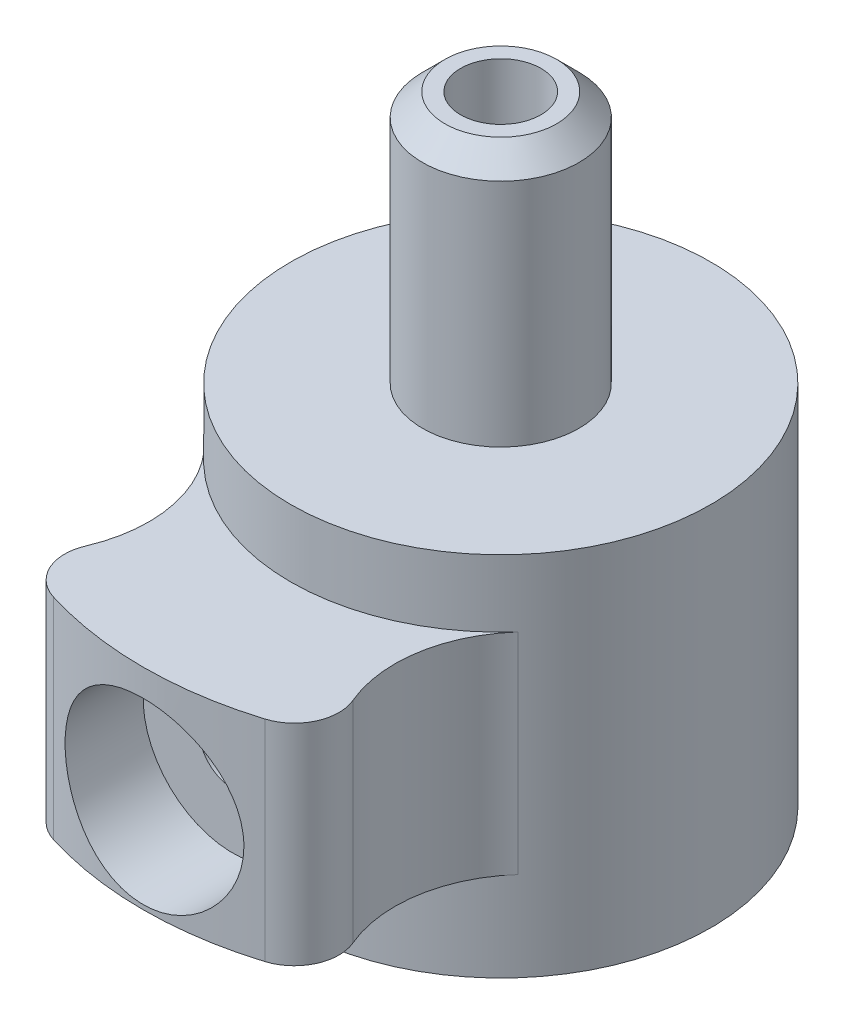
ISO-10303-21;
HEADER;
FILE_DESCRIPTION(('STEP AP214'),'2;1');
FILE_NAME('part.step','',(''),(''),'','','');
FILE_SCHEMA(('AUTOMOTIVE_DESIGN { 1 0 10303 214 1 1 1 1 }'));
ENDSEC;
DATA;
#1=APPLICATION_CONTEXT('core data for automotive mechanical design processes');
#2=APPLICATION_PROTOCOL_DEFINITION('international standard','automotive_design',2000,#1);
#3=PRODUCT_CONTEXT('',#1,'mechanical');
#4=PRODUCT('Part','Part','',(#3));
#5=PRODUCT_RELATED_PRODUCT_CATEGORY('part','',(#4));
#6=PRODUCT_DEFINITION_FORMATION('','',#4);
#7=PRODUCT_DEFINITION_CONTEXT('part definition',#1,'design');
#8=PRODUCT_DEFINITION('design','',#6,#7);
#9=PRODUCT_DEFINITION_SHAPE('','',#8);
#10=(LENGTH_UNIT() NAMED_UNIT(*) SI_UNIT(.MILLI.,.METRE.));
#11=(NAMED_UNIT(*) PLANE_ANGLE_UNIT() SI_UNIT($,.RADIAN.));
#12=(NAMED_UNIT(*) SI_UNIT($,.STERADIAN.) SOLID_ANGLE_UNIT());
#13=UNCERTAINTY_MEASURE_WITH_UNIT(LENGTH_MEASURE(1.E-05),#10,'distance_accuracy_value','');
#14=(GEOMETRIC_REPRESENTATION_CONTEXT(3) GLOBAL_UNCERTAINTY_ASSIGNED_CONTEXT((#13)) GLOBAL_UNIT_ASSIGNED_CONTEXT((#10,
#11,#12)) REPRESENTATION_CONTEXT('',''));
#15=CARTESIAN_POINT('',(0.,0.,0.));
#16=DIRECTION('',(0.,0.,1.));
#17=DIRECTION('',(1.,0.,0.));
#18=AXIS2_PLACEMENT_3D('',#15,#16,#17);
#19=CARTESIAN_POINT('',(0.,0.,0.));
#20=DIRECTION('',(0.,-1.,0.));
#21=DIRECTION('',(0.,0.,-1.));
#22=AXIS2_PLACEMENT_3D('',#19,#20,#21);
#23=CYLINDRICAL_SURFACE('',#22,8.);
#24=CARTESIAN_POINT('',(2.,4.1,7.74596669241483));
#25=CARTESIAN_POINT('',(1.99999686287446,3.98955939925874,7.74596880070288));
#26=CARTESIAN_POINT('',(1.99082099639812,3.87908408105718,7.74835444811678));
#27=CARTESIAN_POINT('',(1.95441850037103,3.66130593746119,7.75761489594051));
#28=CARTESIAN_POINT('',(1.92718136539368,3.55400499642545,7.76449230897304));
#29=CARTESIAN_POINT('',(1.85559295970563,3.34575716945025,7.7819097967692));
#30=CARTESIAN_POINT('',(1.81126378228359,3.24480227569143,7.79244514152366));
#31=CARTESIAN_POINT('',(1.70681691300911,3.05175131796809,7.81598553623007));
#32=CARTESIAN_POINT('',(1.64669855084855,2.95965563033582,7.82899069102791));
#33=CARTESIAN_POINT('',(1.51096674184951,2.78491068379023,7.856325730845));
#34=CARTESIAN_POINT('',(1.43506951016324,2.70248511971996,7.87067678098427));
#35=CARTESIAN_POINT('',(1.27054565128053,2.55139088451173,7.89890300412235));
#36=CARTESIAN_POINT('',(1.18191783534424,2.4827234995026,7.91277813253111));
#37=CARTESIAN_POINT('',(0.992916160863163,2.36017962589497,7.93872332416466));
#38=CARTESIAN_POINT('',(0.892395660956096,2.30652288947082,7.95076549920474));
#39=CARTESIAN_POINT('',(0.68341054743421,2.21695228467753,7.97144649540787));
#40=CARTESIAN_POINT('',(0.574947108633552,2.18103579846759,7.98008581867475));
#41=CARTESIAN_POINT('',(0.355487007003329,2.12868173233713,7.99283807078544));
#42=CARTESIAN_POINT('',(0.24458617563918,2.11186428453873,7.99703915075451));
#43=CARTESIAN_POINT('',(0.021463055410215,2.09699329657956,8.00074875285838));
#44=CARTESIAN_POINT('',(-0.0907590356304554,2.09893698223232,8.00025796877363));
#45=CARTESIAN_POINT('',(-0.310704494344775,2.12125988020011,7.99470475962828));
#46=CARTESIAN_POINT('',(-0.418472431202135,2.14122906004308,7.98974401872699));
#47=CARTESIAN_POINT('',(-0.629076494827373,2.1983770160388,7.97592669219883));
#48=CARTESIAN_POINT('',(-0.731912358740877,2.23555670830192,7.96706989918753));
#49=CARTESIAN_POINT('',(-0.930813407003614,2.32640205654965,7.94630007760717));
#50=CARTESIAN_POINT('',(-1.02680901953301,2.38021363572939,7.93436015756043));
#51=CARTESIAN_POINT('',(-1.20855124468098,2.502684543293,7.90871923047719));
#52=CARTESIAN_POINT('',(-1.29429607017101,2.57134645484849,7.89501791721992));
#53=CARTESIAN_POINT('',(-1.45554807016991,2.7237669935859,7.86690971015616));
#54=CARTESIAN_POINT('',(-1.5307153581504,2.80788391387822,7.85249375620734));
#55=CARTESIAN_POINT('',(-1.66595275192604,2.9876799788322,7.82492034813365));
#56=CARTESIAN_POINT('',(-1.72602215209203,3.0833596635928,7.81176295284776));
#57=CARTESIAN_POINT('',(-1.8295762580452,3.28423202731917,7.78816397465319));
#58=CARTESIAN_POINT('',(-1.87297913394098,3.38946858425055,7.77773586980577));
#59=CARTESIAN_POINT('',(-1.94137124127268,3.60606837446116,7.76094912111966));
#60=CARTESIAN_POINT('',(-1.96636441310582,3.71743029118651,7.75458960648175));
#61=CARTESIAN_POINT('',(-1.99666371093214,3.9399676012185,7.74684284831313));
#62=CARTESIAN_POINT('',(-2.0024723791357,4.0510702346637,7.74532871274919));
#63=CARTESIAN_POINT('',(-1.99561359241244,4.27265754926252,7.74709874784831));
#64=CARTESIAN_POINT('',(-1.98294783827904,4.38314228636099,7.75038247681013));
#65=CARTESIAN_POINT('',(-1.93994037115013,4.59849141196376,7.76125665563648));
#66=CARTESIAN_POINT('',(-1.9098912546254,4.70341818125667,7.768775761875));
#67=CARTESIAN_POINT('',(-1.8332944653365,4.90674516628135,7.7872057461677));
#68=CARTESIAN_POINT('',(-1.78674483817004,5.00514460724427,7.79811702598891));
#69=CARTESIAN_POINT('',(-1.67741653434925,5.19475302229388,7.8223690967461));
#70=CARTESIAN_POINT('',(-1.6143374030685,5.28578307203448,7.83575334885313));
#71=CARTESIAN_POINT('',(-1.47412058586891,5.45615069024108,7.86333666457373));
#72=CARTESIAN_POINT('',(-1.39698058961088,5.53548633332006,7.87753586182776));
#73=CARTESIAN_POINT('',(-1.22852544196945,5.68224883405676,7.90557922425285));
#74=CARTESIAN_POINT('',(-1.13690390506318,5.74932805003905,7.91940561649468));
#75=CARTESIAN_POINT('',(-0.94340536538935,5.86714869356099,7.94477773290987));
#76=CARTESIAN_POINT('',(-0.841528897915181,5.91789097328656,7.95632357603169));
#77=CARTESIAN_POINT('',(-0.631116403462181,6.00115682762234,7.9757609259065));
#78=CARTESIAN_POINT('',(-0.522634762055764,6.03381142750325,7.98367864017925));
#79=CARTESIAN_POINT('',(-0.301499520637614,6.08036826768673,7.99508234716634));
#80=CARTESIAN_POINT('',(-0.188846730082481,6.09427412699123,7.99856919514738));
#81=CARTESIAN_POINT('',(0.0341670528866469,6.10273517915108,8.00068338817612));
#82=CARTESIAN_POINT('',(0.144507653932044,6.09780341819081,7.99943957759977));
#83=CARTESIAN_POINT('',(0.362734992829503,6.0699043454113,7.99251792914887));
#84=CARTESIAN_POINT('',(0.470621803561858,6.04693756997366,7.98684022314338));
#85=CARTESIAN_POINT('',(0.680342071289548,5.98389556045828,7.97170865707778));
#86=CARTESIAN_POINT('',(0.782204989161726,5.94391309337124,7.96227529004785));
#87=CARTESIAN_POINT('',(0.977834106083248,5.84805884196085,7.94062577827316));
#88=CARTESIAN_POINT('',(1.07159928253127,5.79218505465903,7.92840928277515));
#89=CARTESIAN_POINT('',(1.25080385684661,5.66456953200773,7.90214499360574));
#90=CARTESIAN_POINT('',(1.33598997659667,5.59247971419234,7.88806033883329));
#91=CARTESIAN_POINT('',(1.49323004054701,5.4351542960453,7.85981298114379));
#92=CARTESIAN_POINT('',(1.56528065015318,5.34991536777767,7.84565025934604));
#93=CARTESIAN_POINT('',(1.69552405294366,5.16679717162108,7.81854951691005));
#94=CARTESIAN_POINT('',(1.75343323883276,5.06871175326949,7.80563927346578));
#95=CARTESIAN_POINT('',(1.85185379317094,4.86388902025036,7.78287910989656));
#96=CARTESIAN_POINT('',(1.8923778195043,4.7571580678123,7.77302696466428));
#97=CARTESIAN_POINT('',(1.94884505714201,4.55884597632968,7.75903817501475));
#98=CARTESIAN_POINT('',(1.96798634119376,4.46821367122772,7.75417326006998));
#99=CARTESIAN_POINT('',(1.99356458514354,4.28506226200462,7.7476367716524));
#100=CARTESIAN_POINT('',(2.0000026287435,4.19254331951119,7.74596492578215));
#101=CARTESIAN_POINT('',(2.,4.1,7.74596669241483));
#102=B_SPLINE_CURVE_WITH_KNOTS('',3,(#24,#25,#26,#27,#28,#29,#30,#31,#32,#33,#34,#35,#36,#37,
#38,#39,#40,#41,#42,#43,#44,#45,#46,#47,#48,#49,#50,#51,#52,#53,#54,#55,#56,#57,#58,#59,#60,#61,
#62,#63,#64,#65,#66,#67,#68,#69,#70,#71,#72,#73,#74,#75,#76,#77,#78,#79,#80,#81,#82,#83,#84,#85,
#86,#87,#88,#89,#90,#91,#92,#93,#94,#95,#96,#97,#98,#99,#100,#101),.UNSPECIFIED.,.T.,.F.,(4,2,2,
2,2,2,2,2,2,2,2,2,2,2,2,2,2,2,2,2,2,2,2,2,2,2,2,2,2,2,2,2,2,2,2,2,2,2,4),(0.,0.330981953388909,
0.662156593142933,0.992904581732817,1.32366661404383,1.66099163354381,1.99834817183893,
2.34041197118336,2.68242527877674,3.01751000796277,3.35254518932816,3.68014610151158,
4.00776445379829,4.33834299403556,4.66897908375131,5.00856373257529,5.34816424959842,
5.68941145606722,6.03058560103638,6.36274859809374,6.69488101747042,7.02157924007366,
7.34831617137134,7.68146276687326,8.01466415108036,8.35620264772255,8.69772332575643,
9.03673658245543,9.37568439127231,9.70546756901965,10.0352409390158,10.3632390124777,
10.6912784459046,11.0271767726566,11.3631602525241,11.7054118182895,12.0474137709606,
12.3247826174462,12.6021278008238),.UNSPECIFIED.);
#103=CARTESIAN_POINT('',(2.,4.1,7.74596669241483));
#104=VERTEX_POINT('',#103);
#105=EDGE_CURVE('E147',#104,#104,#102,.T.);
#106=ORIENTED_EDGE('',*,*,#105,.T.);
#107=EDGE_LOOP('',(#106));
#108=FACE_BOUND('',#107,.T.);
#109=CARTESIAN_POINT('',(0.,2.,0.));
#110=DIRECTION('',(0.,-1.,0.));
#111=DIRECTION('',(0.,0.,-1.));
#112=AXIS2_PLACEMENT_3D('',#109,#110,#111);
#113=CIRCLE('',#112,8.);
#114=CARTESIAN_POINT('',(2.36484696607376,2.,7.64247988725203));
#115=VERTEX_POINT('',#114);
#116=CARTESIAN_POINT('',(-2.36484696607376,2.,7.64247988725203));
#117=VERTEX_POINT('',#116);
#118=EDGE_CURVE('E214',#115,#117,#113,.T.);
#119=ORIENTED_EDGE('',*,*,#118,.F.);
#120=DIRECTION('',(0.,-1.,0.));
#121=VECTOR('',#120,1.);
#122=CARTESIAN_POINT('',(2.36484696607376,0.,7.64247988725203));
#123=LINE('',#122,#121);
#124=CARTESIAN_POINT('',(2.36484696607376,6.7,7.64247988725203));
#125=VERTEX_POINT('',#124);
#126=EDGE_CURVE('E143',#115,#125,#123,.F.);
#127=ORIENTED_EDGE('',*,*,#126,.T.);
#128=CARTESIAN_POINT('',(0.,6.7,0.));
#129=DIRECTION('',(0.,1.,0.));
#130=DIRECTION('',(0.,0.,1.));
#131=AXIS2_PLACEMENT_3D('',#128,#129,#130);
#132=CIRCLE('',#131,8.);
#133=CARTESIAN_POINT('',(-2.36484696607376,6.7,7.64247988725203));
#134=VERTEX_POINT('',#133);
#135=EDGE_CURVE('E223',#134,#125,#132,.T.);
#136=ORIENTED_EDGE('',*,*,#135,.F.);
#137=DIRECTION('',(0.,-1.,0.));
#138=VECTOR('',#137,1.);
#139=CARTESIAN_POINT('',(-2.36484696607376,0.,7.64247988725203));
#140=LINE('',#139,#138);
#141=EDGE_CURVE('E140',#134,#117,#140,.T.);
#142=ORIENTED_EDGE('',*,*,#141,.T.);
#143=EDGE_LOOP('',(#119,#127,#136,#142));
#144=FACE_BOUND('',#143,.T.);
#145=ADVANCED_FACE('F36',(#108,#144),#23,.T.);
#146=CARTESIAN_POINT('',(5.75,0.,5.12127913709065));
#147=DIRECTION('',(0.,1.,0.));
#148=DIRECTION('',(0.,0.,1.));
#149=AXIS2_PLACEMENT_3D('',#146,#147,#148);
#150=CYLINDRICAL_SURFACE('',#149,3.);
#151=CARTESIAN_POINT('',(5.75,2.,5.12127913709065));
#152=DIRECTION('',(0.,-1.,0.));
#153=DIRECTION('',(0.,0.,-1.));
#154=AXIS2_PLACEMENT_3D('',#151,#152,#153);
#155=CIRCLE('',#154,3.);
#156=CARTESIAN_POINT('',(3.50974025974026,2.,3.1259755771852));
#157=VERTEX_POINT('',#156);
#158=CARTESIAN_POINT('',(2.9894308214859,2.,6.29569721028181));
#159=VERTEX_POINT('',#158);
#160=EDGE_CURVE('E96',#157,#159,#155,.F.);
#161=ORIENTED_EDGE('',*,*,#160,.F.);
#162=DIRECTION('',(0.,1.,0.));
#163=VECTOR('',#162,1.);
#164=CARTESIAN_POINT('',(3.50974025974026,0.,3.12597557718521));
#165=LINE('',#164,#163);
#166=CARTESIAN_POINT('',(3.50974025974026,6.7,3.1259755771852));
#167=VERTEX_POINT('',#166);
#168=EDGE_CURVE('E107',#157,#167,#165,.T.);
#169=ORIENTED_EDGE('',*,*,#168,.T.);
#170=CARTESIAN_POINT('',(5.75,6.7,5.12127913709065));
#171=DIRECTION('',(0.,1.,0.));
#172=DIRECTION('',(0.,0.,1.));
#173=AXIS2_PLACEMENT_3D('',#170,#171,#172);
#174=CIRCLE('',#173,3.);
#175=CARTESIAN_POINT('',(2.9894308214859,6.7,6.29569721028181));
#176=VERTEX_POINT('',#175);
#177=EDGE_CURVE('E222',#176,#167,#174,.F.);
#178=ORIENTED_EDGE('',*,*,#177,.F.);
#179=DIRECTION('',(0.,1.,0.));
#180=VECTOR('',#179,1.);
#181=CARTESIAN_POINT('',(2.9894308214859,0.,6.29569721028181));
#182=LINE('',#181,#180);
#183=EDGE_CURVE('E109',#176,#159,#182,.F.);
#184=ORIENTED_EDGE('',*,*,#183,.T.);
#185=EDGE_LOOP('',(#161,#169,#178,#184));
#186=FACE_BOUND('',#185,.T.);
#187=ADVANCED_FACE('F106',(#186),#150,.F.);
#188=CARTESIAN_POINT('',(-5.75,0.,5.12127913709065));
#189=DIRECTION('',(0.,1.,0.));
#190=DIRECTION('',(0.,0.,1.));
#191=AXIS2_PLACEMENT_3D('',#188,#189,#190);
#192=CYLINDRICAL_SURFACE('',#191,3.);
#193=CARTESIAN_POINT('',(-5.75,2.,5.12127913709065));
#194=DIRECTION('',(0.,-1.,0.));
#195=DIRECTION('',(0.,0.,-1.));
#196=AXIS2_PLACEMENT_3D('',#193,#194,#195);
#197=CIRCLE('',#196,3.);
#198=CARTESIAN_POINT('',(-2.9894308214859,2.,6.29569721028181));
#199=VERTEX_POINT('',#198);
#200=CARTESIAN_POINT('',(-3.50974025974026,2.,3.12597557718521));
#201=VERTEX_POINT('',#200);
#202=EDGE_CURVE('E98',#199,#201,#197,.F.);
#203=ORIENTED_EDGE('',*,*,#202,.F.);
#204=DIRECTION('',(0.,1.,0.));
#205=VECTOR('',#204,1.);
#206=CARTESIAN_POINT('',(-2.9894308214859,0.,6.29569721028181));
#207=LINE('',#206,#205);
#208=CARTESIAN_POINT('',(-2.9894308214859,6.7,6.29569721028181));
#209=VERTEX_POINT('',#208);
#210=EDGE_CURVE('E52',#199,#209,#207,.T.);
#211=ORIENTED_EDGE('',*,*,#210,.T.);
#212=CARTESIAN_POINT('',(-5.75,6.7,5.12127913709065));
#213=DIRECTION('',(0.,1.,0.));
#214=DIRECTION('',(0.,0.,1.));
#215=AXIS2_PLACEMENT_3D('',#212,#213,#214);
#216=CIRCLE('',#215,3.);
#217=CARTESIAN_POINT('',(-3.50974025974026,6.7,3.12597557718521));
#218=VERTEX_POINT('',#217);
#219=EDGE_CURVE('E225',#218,#209,#216,.F.);
#220=ORIENTED_EDGE('',*,*,#219,.F.);
#221=DIRECTION('',(0.,1.,0.));
#222=VECTOR('',#221,1.);
#223=CARTESIAN_POINT('',(-3.50974025974026,0.,3.12597557718521));
#224=LINE('',#223,#222);
#225=EDGE_CURVE('E118',#201,#218,#224,.T.);
#226=ORIENTED_EDGE('',*,*,#225,.F.);
#227=EDGE_LOOP('',(#203,#211,#220,#226));
#228=FACE_BOUND('',#227,.T.);
#229=ADVANCED_FACE('F210',(#228),#192,.F.);
#230=CARTESIAN_POINT('',(2.06924109531454,0.,6.68716990134552));
#231=DIRECTION('',(0.,-1.,0.));
#232=DIRECTION('',(0.,0.,-1.));
#233=AXIS2_PLACEMENT_3D('',#230,#231,#232);
#234=CYLINDRICAL_SURFACE('',#233,1.);
#235=ORIENTED_EDGE('',*,*,#126,.F.);
#236=CARTESIAN_POINT('',(2.06924109531454,2.,6.68716990134552));
#237=DIRECTION('',(0.,-1.,0.));
#238=DIRECTION('',(0.,0.,-1.));
#239=AXIS2_PLACEMENT_3D('',#236,#237,#238);
#240=CIRCLE('',#239,1.);
#241=EDGE_CURVE('E111',#115,#159,#240,.F.);
#242=ORIENTED_EDGE('',*,*,#241,.T.);
#243=ORIENTED_EDGE('',*,*,#183,.F.);
#244=CARTESIAN_POINT('',(2.06924109531454,6.7,6.68716990134552));
#245=DIRECTION('',(0.,1.,0.));
#246=DIRECTION('',(0.,0.,1.));
#247=AXIS2_PLACEMENT_3D('',#244,#245,#246);
#248=CIRCLE('',#247,1.);
#249=EDGE_CURVE('E60',#176,#125,#248,.F.);
#250=ORIENTED_EDGE('',*,*,#249,.T.);
#251=EDGE_LOOP('',(#235,#242,#243,#250));
#252=FACE_BOUND('',#251,.T.);
#253=ADVANCED_FACE('F221',(#252),#234,.T.);
#254=CARTESIAN_POINT('',(-2.06924109531454,0.,6.68716990134552));
#255=DIRECTION('',(0.,1.,0.));
#256=DIRECTION('',(0.,0.,1.));
#257=AXIS2_PLACEMENT_3D('',#254,#255,#256);
#258=CYLINDRICAL_SURFACE('',#257,1.);
#259=ORIENTED_EDGE('',*,*,#210,.F.);
#260=CARTESIAN_POINT('',(-2.06924109531454,2.,6.68716990134552));
#261=DIRECTION('',(0.,-1.,0.));
#262=DIRECTION('',(0.,0.,-1.));
#263=AXIS2_PLACEMENT_3D('',#260,#261,#262);
#264=CIRCLE('',#263,1.);
#265=EDGE_CURVE('E102',#199,#117,#264,.F.);
#266=ORIENTED_EDGE('',*,*,#265,.T.);
#267=ORIENTED_EDGE('',*,*,#141,.F.);
#268=CARTESIAN_POINT('',(-2.06924109531454,6.7,6.68716990134552));
#269=DIRECTION('',(0.,1.,0.));
#270=DIRECTION('',(0.,0.,1.));
#271=AXIS2_PLACEMENT_3D('',#268,#269,#270);
#272=CIRCLE('',#271,1.);
#273=EDGE_CURVE('E160',#134,#209,#272,.F.);
#274=ORIENTED_EDGE('',*,*,#273,.T.);
#275=EDGE_LOOP('',(#259,#266,#267,#274));
#276=FACE_BOUND('',#275,.T.);
#277=ADVANCED_FACE('F201',(#276),#258,.T.);
#278=CARTESIAN_POINT('',(0.,0.,8.));
#279=DIRECTION('',(0.,1.,0.));
#280=DIRECTION('',(0.,0.,1.));
#281=AXIS2_PLACEMENT_3D('',#278,#279,#280);
#282=PLANE('',#281);
#283=CARTESIAN_POINT('',(0.,0.,0.));
#284=DIRECTION('',(0.,-1.,0.));
#285=DIRECTION('',(0.,0.,-1.));
#286=AXIS2_PLACEMENT_3D('',#283,#284,#285);
#287=CIRCLE('',#286,3.4);
#288=CARTESIAN_POINT('',(0.,0.,-3.4));
#289=VERTEX_POINT('',#288);
#290=EDGE_CURVE('E137',#289,#289,#287,.T.);
#291=ORIENTED_EDGE('',*,*,#290,.F.);
#292=EDGE_LOOP('',(#291));
#293=FACE_BOUND('',#292,.T.);
#294=CARTESIAN_POINT('',(0.,0.,0.));
#295=DIRECTION('',(0.,-1.,0.));
#296=DIRECTION('',(0.,0.,1.));
#297=AXIS2_PLACEMENT_3D('',#294,#295,#296);
#298=CIRCLE('',#297,4.7);
#299=CARTESIAN_POINT('',(0.,0.,4.7));
#300=VERTEX_POINT('',#299);
#301=EDGE_CURVE('E123',#300,#300,#298,.T.);
#302=ORIENTED_EDGE('',*,*,#301,.T.);
#303=EDGE_LOOP('',(#302));
#304=FACE_BOUND('',#303,.T.);
#305=ADVANCED_FACE('F193',(#293,#304),#282,.F.);
#306=CARTESIAN_POINT('',(0.,8.2,1.75));
#307=DIRECTION('',(0.,-1.,0.));
#308=DIRECTION('',(0.,0.,-1.));
#309=AXIS2_PLACEMENT_3D('',#306,#307,#308);
#310=PLANE('',#309);
#311=CARTESIAN_POINT('',(0.,8.2,0.));
#312=DIRECTION('',(0.,-1.,0.));
#313=DIRECTION('',(0.,0.,-1.));
#314=AXIS2_PLACEMENT_3D('',#311,#312,#313);
#315=CIRCLE('',#314,1.75);
#316=CARTESIAN_POINT('',(0.,8.2,-1.75));
#317=VERTEX_POINT('',#316);
#318=EDGE_CURVE('E117',#317,#317,#315,.T.);
#319=ORIENTED_EDGE('',*,*,#318,.T.);
#320=EDGE_LOOP('',(#319));
#321=FACE_BOUND('',#320,.T.);
#322=CARTESIAN_POINT('',(0.,8.2,0.));
#323=DIRECTION('',(0.,-1.,0.));
#324=DIRECTION('',(0.,0.,1.));
#325=AXIS2_PLACEMENT_3D('',#322,#323,#324);
#326=CIRCLE('',#325,4.7);
#327=CARTESIAN_POINT('',(0.,8.2,4.7));
#328=VERTEX_POINT('',#327);
#329=EDGE_CURVE('E126',#328,#328,#326,.T.);
#330=ORIENTED_EDGE('',*,*,#329,.F.);
#331=EDGE_LOOP('',(#330));
#332=FACE_BOUND('',#331,.T.);
#333=ADVANCED_FACE('F191',(#321,#332),#310,.F.);
#334=CARTESIAN_POINT('',(0.,4.1,-4.701));
#335=DIRECTION('',(0.,0.,1.));
#336=DIRECTION('',(1.,0.,0.));
#337=AXIS2_PLACEMENT_3D('',#334,#335,#336);
#338=CYLINDRICAL_SURFACE('',#337,0.75);
#339=CARTESIAN_POINT('',(0.75,4.1,3.31624787975809));
#340=CARTESIAN_POINT('',(0.749998582339946,4.05842581951886,3.31624872005877));
#341=CARTESIAN_POINT('',(0.746531416948292,4.0168346801017,3.31703818958441));
#342=CARTESIAN_POINT('',(0.732769926569842,3.93483582505417,3.32010483657509));
#343=CARTESIAN_POINT('',(0.722470720184634,3.89442897715338,3.32238307772944));
#344=CARTESIAN_POINT('',(0.695385756517453,3.81599670369342,3.32815697662774));
#345=CARTESIAN_POINT('',(0.678607186262015,3.7779686936016,3.33165128506523));
#346=CARTESIAN_POINT('',(0.639060424664764,3.70526630509204,3.33946197041337));
#347=CARTESIAN_POINT('',(0.616292335102381,3.67059186970096,3.34377833335458));
#348=CARTESIAN_POINT('',(0.564995883108992,3.60498477053146,3.35282963250563));
#349=CARTESIAN_POINT('',(0.536384047173843,3.57411811033786,3.35757000038677));
#350=CARTESIAN_POINT('',(0.474392462707131,3.51758100673361,3.3668876615679));
#351=CARTESIAN_POINT('',(0.441012339964237,3.49191097153247,3.37146494203367));
#352=CARTESIAN_POINT('',(0.369988649610181,3.44623420778324,3.37999989877369));
#353=CARTESIAN_POINT('',(0.332303271596079,3.42629103874409,3.38395041855463));
#354=CARTESIAN_POINT('',(0.254014264579267,3.39304544435582,3.39072534842242));
#355=CARTESIAN_POINT('',(0.213410969344838,3.37974226086542,3.39354988706428));
#356=CARTESIAN_POINT('',(0.131125098086986,3.36036207189963,3.3977162214097));
#357=CARTESIAN_POINT('',(0.0894700161236889,3.35417333666845,3.39908091892868));
#358=CARTESIAN_POINT('',(0.00569199742637008,3.34884830968907,3.40025318018674));
#359=CARTESIAN_POINT('',(-0.0364308843384399,3.34971119790972,3.40006092498339));
#360=CARTESIAN_POINT('',(-0.119178295080699,3.35838186935327,3.3981584200502));
#361=CARTESIAN_POINT('',(-0.159816138807634,3.3660692127486,3.39647449679256));
#362=CARTESIAN_POINT('',(-0.239210377413701,3.38797856142318,3.39180789565737));
#363=CARTESIAN_POINT('',(-0.277966686185139,3.40220086546118,3.38882515840227));
#364=CARTESIAN_POINT('',(-0.352831087009229,3.43688243416251,3.38185385246547));
#365=CARTESIAN_POINT('',(-0.38891739537208,3.4573871943045,3.37785798469191));
#366=CARTESIAN_POINT('',(-0.457180752084072,3.50401766400834,3.36929829968005));
#367=CARTESIAN_POINT('',(-0.489357258429599,3.53014415150483,3.36473440387493));
#368=CARTESIAN_POINT('',(-0.549604081224562,3.58793159581962,3.35542629431237));
#369=CARTESIAN_POINT('',(-0.577573112138248,3.61969795724054,3.3506803084718));
#370=CARTESIAN_POINT('',(-0.627806082923928,3.68751931660961,3.34163326734079));
#371=CARTESIAN_POINT('',(-0.650069862756676,3.72357443482108,3.33733222453356));
#372=CARTESIAN_POINT('',(-0.68830644101429,3.79911552988697,3.32965726732024));
#373=CARTESIAN_POINT('',(-0.704259806918885,3.83861165440036,3.32628622629114));
#374=CARTESIAN_POINT('',(-0.729272218237242,3.91981623023336,3.3208925690316));
#375=CARTESIAN_POINT('',(-0.73833237801384,3.96152432279724,3.31886973485521));
#376=CARTESIAN_POINT('',(-0.749143479439415,4.04504262802758,3.31644605068223));
#377=CARTESIAN_POINT('',(-0.751042028354165,4.08683280552242,3.31601245053056));
#378=CARTESIAN_POINT('',(-0.747875897449464,4.17013255005637,3.31672793774314));
#379=CARTESIAN_POINT('',(-0.74281170482546,4.2116421365247,3.31787691437169));
#380=CARTESIAN_POINT('',(-0.725991992148639,4.29268653723467,3.32159714187023));
#381=CARTESIAN_POINT('',(-0.71431802953085,4.3322391475544,3.32415104672531));
#382=CARTESIAN_POINT('',(-0.684698582685188,4.40882694713861,3.33037767592761));
#383=CARTESIAN_POINT('',(-0.666752489746047,4.44586189164635,3.33405050886253));
#384=CARTESIAN_POINT('',(-0.624773920906688,4.51700109924854,3.34217294362149));
#385=CARTESIAN_POINT('',(-0.600650666346241,4.55105048409557,3.3466337929954));
#386=CARTESIAN_POINT('',(-0.547121100171376,4.6146720288906,3.35580009120734));
#387=CARTESIAN_POINT('',(-0.517714120706205,4.64424362198424,3.36050557091259));
#388=CARTESIAN_POINT('',(-0.45378337439345,4.69864448562991,3.3697390686908));
#389=CARTESIAN_POINT('',(-0.419173045674619,4.72337303708648,3.37426201998127));
#390=CARTESIAN_POINT('',(-0.346203926370272,4.76666498200197,3.38252701707703));
#391=CARTESIAN_POINT('',(-0.307845312528901,4.78522866597357,3.38626909967682));
#392=CARTESIAN_POINT('',(-0.228709495689223,4.815524352047,3.39252939442084));
#393=CARTESIAN_POINT('',(-0.187949665003122,4.82730004540438,3.39505541603837));
#394=CARTESIAN_POINT('',(-0.104968201740017,4.84382167747179,3.39863276667853));
#395=CARTESIAN_POINT('',(-0.0627467864456624,4.84856865653336,3.3996843139435));
#396=CARTESIAN_POINT('',(0.0210037724366131,4.85085066687402,3.40018761813955));
#397=CARTESIAN_POINT('',(0.0625286920430216,4.84853597230427,3.39967271028263));
#398=CARTESIAN_POINT('',(0.144582135892952,4.83709692479858,3.39717252151468));
#399=CARTESIAN_POINT('',(0.185110678631682,4.82797269836305,3.39518726791823));
#400=CARTESIAN_POINT('',(0.2639023569728,4.80324612153142,3.38997207444818));
#401=CARTESIAN_POINT('',(0.302172579099125,4.78766541869602,3.38674629643677));
#402=CARTESIAN_POINT('',(0.375575424750509,4.75048914762569,3.37939423151996));
#403=CARTESIAN_POINT('',(0.410707737676192,4.72889298483248,3.37526785560966));
#404=CARTESIAN_POINT('',(0.477569392091135,4.67981060448005,3.36646517165182));
#405=CARTESIAN_POINT('',(0.509220118570415,4.65221891134604,3.36177979916691));
#406=CARTESIAN_POINT('',(0.567493562725897,4.5921410115814,3.35243554214816));
#407=CARTESIAN_POINT('',(0.594115063826542,4.55965362408444,3.34777666428708));
#408=CARTESIAN_POINT('',(0.641924918074432,4.4901731193273,3.3389419119195));
#409=CARTESIAN_POINT('',(0.663034139857082,4.45312454687002,3.3347734993254));
#410=CARTESIAN_POINT('',(0.698693133902001,4.37592142609605,3.32748579008751));
#411=CARTESIAN_POINT('',(0.713248415203157,4.33576951973757,3.3243656128919));
#412=CARTESIAN_POINT('',(0.7328115159273,4.26298532441183,3.32009963214379));
#413=CARTESIAN_POINT('',(0.739244745798712,4.23074552232015,3.31866488048573));
#414=CARTESIAN_POINT('',(0.747839440116533,4.16567398794407,3.31673869616418));
#415=CARTESIAN_POINT('',(0.750001119906534,4.13284228558361,3.31624721594717));
#416=CARTESIAN_POINT('',(0.75,4.1,3.31624787975809));
#417=B_SPLINE_CURVE_WITH_KNOTS('',3,(#339,#340,#341,#342,#343,#344,#345,#346,#347,#348,#349,
#350,#351,#352,#353,#354,#355,#356,#357,#358,#359,#360,#361,#362,#363,#364,#365,#366,#367,#368,
#369,#370,#371,#372,#373,#374,#375,#376,#377,#378,#379,#380,#381,#382,#383,#384,#385,#386,#387,
#388,#389,#390,#391,#392,#393,#394,#395,#396,#397,#398,#399,#400,#401,#402,#403,#404,#405,#406,
#407,#408,#409,#410,#411,#412,#413,#414,#415,#416),.UNSPECIFIED.,.T.,.F.,(4,2,2,2,2,2,2,2,2,2,2,
2,2,2,2,2,2,2,2,2,2,2,2,2,2,2,2,2,2,2,2,2,2,2,2,2,2,2,4),(0.,0.124602164037122,
0.249293450616864,0.373846822831713,0.498398078657637,0.624871486222797,0.75135482477824,
0.879192006674588,1.00701458901715,1.1328010962807,1.25857297607796,1.38216837319897,
1.50576942129208,1.63028759448855,1.75482300960407,1.88199340434363,2.00916736597734,
2.13672995850707,2.26427192475174,2.38917030247619,2.51405994128308,2.6374411478627,
2.76083433193506,2.88615688106323,3.01149528183291,3.13921382206853,3.26692634285241,
3.39380738269651,3.52066964043059,3.6448512061807,3.76903046507199,3.89279669642329,
4.01657516497083,4.14273868761815,4.2689326904009,4.39684941976446,4.5246584246527,
4.62309514972783,4.72152691214104),.UNSPECIFIED.);
#418=CARTESIAN_POINT('',(0.75,4.1,3.31624787975809));
#419=VERTEX_POINT('',#418);
#420=EDGE_CURVE('E151',#419,#419,#417,.T.);
#421=ORIENTED_EDGE('',*,*,#420,.T.);
#422=EDGE_LOOP('',(#421));
#423=FACE_BOUND('',#422,.T.);
#424=CARTESIAN_POINT('',(0.,4.1,6.));
#425=DIRECTION('',(0.,0.,1.));
#426=DIRECTION('',(1.,0.,0.));
#427=AXIS2_PLACEMENT_3D('',#424,#425,#426);
#428=CIRCLE('',#427,0.75);
#429=CARTESIAN_POINT('',(0.75,4.1,6.));
#430=VERTEX_POINT('',#429);
#431=EDGE_CURVE('E148',#430,#430,#428,.F.);
#432=ORIENTED_EDGE('',*,*,#431,.F.);
#433=EDGE_LOOP('',(#432));
#434=FACE_BOUND('',#433,.T.);
#435=ADVANCED_FACE('F174',(#423,#434),#338,.F.);
#436=CARTESIAN_POINT('',(0.,0.,0.));
#437=DIRECTION('',(0.,-1.,0.));
#438=DIRECTION('',(0.,0.,-1.));
#439=AXIS2_PLACEMENT_3D('',#436,#437,#438);
#440=CYLINDRICAL_SURFACE('',#439,3.4);
#441=ORIENTED_EDGE('',*,*,#420,.F.);
#442=EDGE_LOOP('',(#441));
#443=FACE_BOUND('',#442,.T.);
#444=CARTESIAN_POINT('',(0.,6.5,0.));
#445=DIRECTION('',(0.,-1.,0.));
#446=DIRECTION('',(0.,0.,-1.));
#447=AXIS2_PLACEMENT_3D('',#444,#445,#446);
#448=CIRCLE('',#447,3.4);
#449=CARTESIAN_POINT('',(0.,6.5,-3.4));
#450=VERTEX_POINT('',#449);
#451=EDGE_CURVE('E134',#450,#450,#448,.T.);
#452=ORIENTED_EDGE('',*,*,#451,.F.);
#453=EDGE_LOOP('',(#452));
#454=FACE_BOUND('',#453,.T.);
#455=ORIENTED_EDGE('',*,*,#290,.T.);
#456=EDGE_LOOP('',(#455));
#457=FACE_BOUND('',#456,.T.);
#458=ADVANCED_FACE('F199',(#443,#454,#457),#440,.F.);
#459=CARTESIAN_POINT('',(0.,6.5,3.4));
#460=DIRECTION('',(0.,1.,0.));
#461=DIRECTION('',(0.,0.,1.));
#462=AXIS2_PLACEMENT_3D('',#459,#460,#461);
#463=PLANE('',#462);
#464=CARTESIAN_POINT('',(0.,6.5,0.));
#465=DIRECTION('',(0.,-1.,0.));
#466=DIRECTION('',(0.,0.,-1.));
#467=AXIS2_PLACEMENT_3D('',#464,#465,#466);
#468=CIRCLE('',#467,0.9);
#469=CARTESIAN_POINT('',(0.,6.5,-0.9));
#470=VERTEX_POINT('',#469);
#471=EDGE_CURVE('E131',#470,#470,#468,.T.);
#472=ORIENTED_EDGE('',*,*,#471,.F.);
#473=EDGE_LOOP('',(#472));
#474=FACE_BOUND('',#473,.T.);
#475=ORIENTED_EDGE('',*,*,#451,.T.);
#476=EDGE_LOOP('',(#475));
#477=FACE_BOUND('',#476,.T.);
#478=ADVANCED_FACE('F258',(#474,#477),#463,.F.);
#479=CARTESIAN_POINT('',(0.,0.,0.));
#480=DIRECTION('',(0.,-1.,0.));
#481=DIRECTION('',(0.,0.,-1.));
#482=AXIS2_PLACEMENT_3D('',#479,#480,#481);
#483=CYLINDRICAL_SURFACE('',#482,0.9);
#484=CARTESIAN_POINT('',(0.,13.85,0.));
#485=DIRECTION('',(0.,-1.,0.));
#486=DIRECTION('',(0.,0.,-1.));
#487=AXIS2_PLACEMENT_3D('',#484,#485,#486);
#488=CIRCLE('',#487,0.9);
#489=CARTESIAN_POINT('',(0.,13.85,-0.9));
#490=VERTEX_POINT('',#489);
#491=EDGE_CURVE('E121',#490,#490,#488,.T.);
#492=ORIENTED_EDGE('',*,*,#491,.F.);
#493=EDGE_LOOP('',(#492));
#494=FACE_BOUND('',#493,.T.);
#495=ORIENTED_EDGE('',*,*,#471,.T.);
#496=EDGE_LOOP('',(#495));
#497=FACE_BOUND('',#496,.T.);
#498=ADVANCED_FACE('F252',(#494,#497),#483,.F.);
#499=CARTESIAN_POINT('',(0.,13.85,0.9));
#500=DIRECTION('',(0.,-1.,0.));
#501=DIRECTION('',(0.,0.,-1.));
#502=AXIS2_PLACEMENT_3D('',#499,#500,#501);
#503=PLANE('',#502);
#504=CARTESIAN_POINT('',(0.,13.85,0.));
#505=DIRECTION('',(0.,-1.,0.));
#506=DIRECTION('',(0.,0.,-1.));
#507=AXIS2_PLACEMENT_3D('',#504,#505,#506);
#508=CIRCLE('',#507,1.25);
#509=CARTESIAN_POINT('',(0.,13.85,-1.25));
#510=VERTEX_POINT('',#509);
#511=EDGE_CURVE('E12',#510,#510,#508,.F.);
#512=ORIENTED_EDGE('',*,*,#511,.T.);
#513=EDGE_LOOP('',(#512));
#514=FACE_BOUND('',#513,.T.);
#515=ORIENTED_EDGE('',*,*,#491,.T.);
#516=EDGE_LOOP('',(#515));
#517=FACE_BOUND('',#516,.T.);
#518=ADVANCED_FACE('F249',(#514,#517),#503,.F.);
#519=CARTESIAN_POINT('',(0.,0.,0.));
#520=DIRECTION('',(0.,-1.,0.));
#521=DIRECTION('',(0.,0.,-1.));
#522=AXIS2_PLACEMENT_3D('',#519,#520,#521);
#523=CYLINDRICAL_SURFACE('',#522,1.75);
#524=CARTESIAN_POINT('',(0.,13.35,0.));
#525=DIRECTION('',(0.,-1.,0.));
#526=DIRECTION('',(0.,0.,-1.));
#527=AXIS2_PLACEMENT_3D('',#524,#525,#526);
#528=CIRCLE('',#527,1.75);
#529=CARTESIAN_POINT('',(0.,13.35,-1.75));
#530=VERTEX_POINT('',#529);
#531=EDGE_CURVE('E45',#530,#530,#528,.T.);
#532=ORIENTED_EDGE('',*,*,#531,.T.);
#533=EDGE_LOOP('',(#532));
#534=FACE_BOUND('',#533,.T.);
#535=ORIENTED_EDGE('',*,*,#318,.F.);
#536=EDGE_LOOP('',(#535));
#537=FACE_BOUND('',#536,.T.);
#538=ADVANCED_FACE('F238',(#534,#537),#523,.T.);
#539=CARTESIAN_POINT('',(0.,0.,0.));
#540=DIRECTION('',(0.,1.,0.));
#541=DIRECTION('',(0.,0.,1.));
#542=AXIS2_PLACEMENT_3D('',#539,#540,#541);
#543=CYLINDRICAL_SURFACE('',#542,4.7);
#544=ORIENTED_EDGE('',*,*,#168,.F.);
#545=CARTESIAN_POINT('',(0.,2.,0.));
#546=DIRECTION('',(0.,1.,0.));
#547=DIRECTION('',(0.,0.,1.));
#548=AXIS2_PLACEMENT_3D('',#545,#546,#547);
#549=CIRCLE('',#548,4.7);
#550=EDGE_CURVE('E93',#201,#157,#549,.T.);
#551=ORIENTED_EDGE('',*,*,#550,.F.);
#552=ORIENTED_EDGE('',*,*,#225,.T.);
#553=CARTESIAN_POINT('',(0.,6.7,0.));
#554=DIRECTION('',(0.,1.,0.));
#555=DIRECTION('',(0.,0.,1.));
#556=AXIS2_PLACEMENT_3D('',#553,#554,#555);
#557=CIRCLE('',#556,4.7);
#558=EDGE_CURVE('E110',#218,#167,#557,.T.);
#559=ORIENTED_EDGE('',*,*,#558,.T.);
#560=EDGE_LOOP('',(#544,#551,#552,#559));
#561=FACE_BOUND('',#560,.T.);
#562=ORIENTED_EDGE('',*,*,#301,.F.);
#563=EDGE_LOOP('',(#562));
#564=FACE_BOUND('',#563,.T.);
#565=ORIENTED_EDGE('',*,*,#329,.T.);
#566=EDGE_LOOP('',(#565));
#567=FACE_BOUND('',#566,.T.);
#568=ADVANCED_FACE('F114',(#561,#564,#567),#543,.T.);
#569=CARTESIAN_POINT('',(0.,4.1,6.));
#570=DIRECTION('',(0.,0.,1.));
#571=DIRECTION('',(1.,0.,0.));
#572=AXIS2_PLACEMENT_3D('',#569,#570,#571);
#573=CYLINDRICAL_SURFACE('',#572,2.);
#574=CARTESIAN_POINT('',(0.,4.1,6.));
#575=DIRECTION('',(0.,0.,1.));
#576=DIRECTION('',(1.,0.,0.));
#577=AXIS2_PLACEMENT_3D('',#574,#575,#576);
#578=CIRCLE('',#577,2.);
#579=CARTESIAN_POINT('',(2.,4.1,6.));
#580=VERTEX_POINT('',#579);
#581=EDGE_CURVE('E152',#580,#580,#578,.T.);
#582=ORIENTED_EDGE('',*,*,#581,.F.);
#583=EDGE_LOOP('',(#582));
#584=FACE_BOUND('',#583,.T.);
#585=ORIENTED_EDGE('',*,*,#105,.F.);
#586=EDGE_LOOP('',(#585));
#587=FACE_BOUND('',#586,.T.);
#588=ADVANCED_FACE('F164',(#584,#587),#573,.F.);
#589=CARTESIAN_POINT('',(0.,4.1,6.));
#590=DIRECTION('',(0.,0.,1.));
#591=DIRECTION('',(1.,0.,0.));
#592=AXIS2_PLACEMENT_3D('',#589,#590,#591);
#593=PLANE('',#592);
#594=ORIENTED_EDGE('',*,*,#581,.T.);
#595=EDGE_LOOP('',(#594));
#596=FACE_BOUND('',#595,.T.);
#597=ORIENTED_EDGE('',*,*,#431,.T.);
#598=EDGE_LOOP('',(#597));
#599=FACE_BOUND('',#598,.T.);
#600=ADVANCED_FACE('F169',(#596,#599),#593,.T.);
#601=CARTESIAN_POINT('',(0.,6.7,1.65));
#602=DIRECTION('',(0.,1.,0.));
#603=DIRECTION('',(0.,0.,1.));
#604=AXIS2_PLACEMENT_3D('',#601,#602,#603);
#605=PLANE('',#604);
#606=ORIENTED_EDGE('',*,*,#177,.T.);
#607=ORIENTED_EDGE('',*,*,#558,.F.);
#608=ORIENTED_EDGE('',*,*,#219,.T.);
#609=ORIENTED_EDGE('',*,*,#273,.F.);
#610=ORIENTED_EDGE('',*,*,#135,.T.);
#611=ORIENTED_EDGE('',*,*,#249,.F.);
#612=EDGE_LOOP('',(#606,#607,#608,#609,#610,#611));
#613=FACE_BOUND('',#612,.T.);
#614=ADVANCED_FACE('F234',(#613),#605,.T.);
#615=CARTESIAN_POINT('',(0.,2.,0.));
#616=DIRECTION('',(0.,-1.,0.));
#617=DIRECTION('',(0.,0.,-1.));
#618=AXIS2_PLACEMENT_3D('',#615,#616,#617);
#619=PLANE('',#618);
#620=ORIENTED_EDGE('',*,*,#160,.T.);
#621=ORIENTED_EDGE('',*,*,#241,.F.);
#622=ORIENTED_EDGE('',*,*,#118,.T.);
#623=ORIENTED_EDGE('',*,*,#265,.F.);
#624=ORIENTED_EDGE('',*,*,#202,.T.);
#625=ORIENTED_EDGE('',*,*,#550,.T.);
#626=EDGE_LOOP('',(#620,#621,#622,#623,#624,#625));
#627=FACE_BOUND('',#626,.T.);
#628=ADVANCED_FACE('F95',(#627),#619,.T.);
#629=CARTESIAN_POINT('',(0.,13.35,0.));
#630=DIRECTION('',(0.,-1.,0.));
#631=DIRECTION('',(0.,0.,-1.));
#632=AXIS2_PLACEMENT_3D('',#629,#630,#631);
#633=CONICAL_SURFACE('',#632,1.75,0.78539816339745);
#634=ORIENTED_EDGE('',*,*,#511,.F.);
#635=EDGE_LOOP('',(#634));
#636=FACE_BOUND('',#635,.T.);
#637=ORIENTED_EDGE('',*,*,#531,.F.);
#638=EDGE_LOOP('',(#637));
#639=FACE_BOUND('',#638,.T.);
#640=ADVANCED_FACE('F39',(#636,#639),#633,.T.);
#641=CLOSED_SHELL('',(#145,#187,#229,#253,#277,#305,#333,#435,#458,#478,#498,#518,#538,#568,
#588,#600,#614,#628,#640));
#642=MANIFOLD_SOLID_BREP('B2',#641);
#643=ADVANCED_BREP_SHAPE_REPRESENTATION('',(#18,#642),#14);
#644=SHAPE_DEFINITION_REPRESENTATION(#9,#643);
ENDSEC;
END-ISO-10303-21;
